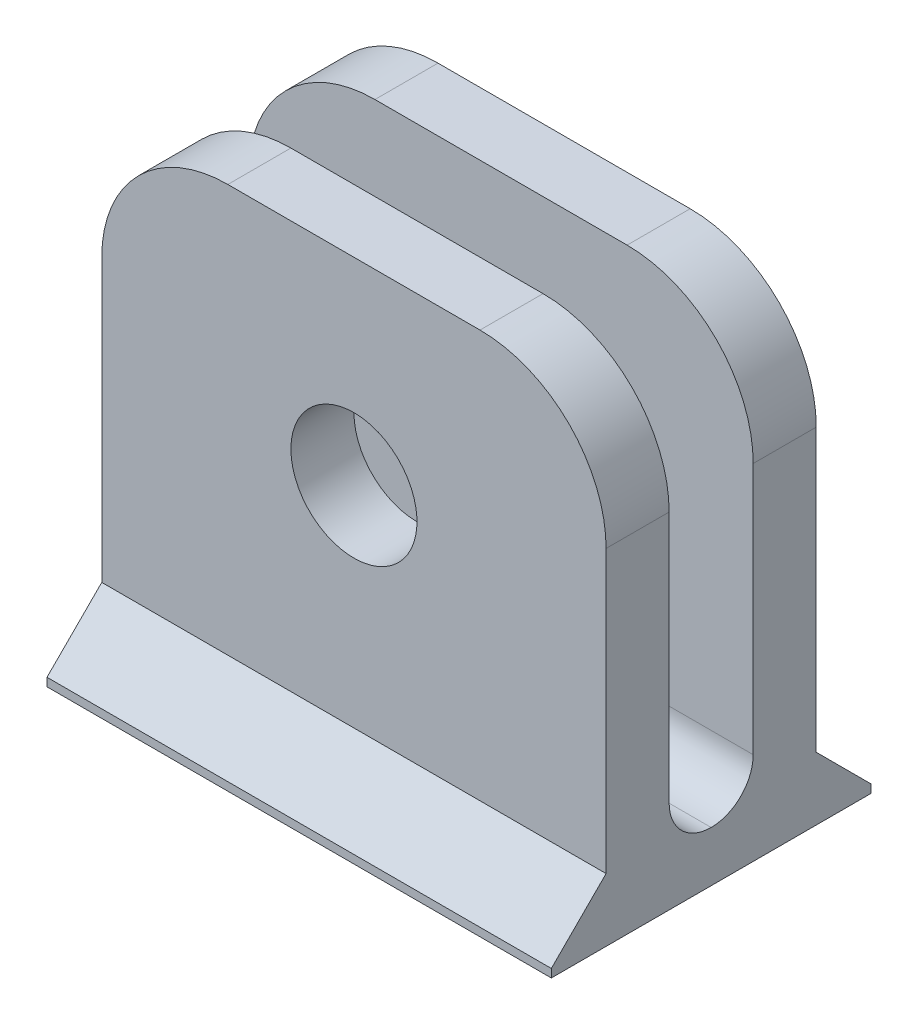
ISO-10303-21;
HEADER;
FILE_DESCRIPTION(('STEP AP214'),'2;1');
FILE_NAME('part.step','',(''),(''),'','','');
FILE_SCHEMA(('AUTOMOTIVE_DESIGN { 1 0 10303 214 1 1 1 1 }'));
ENDSEC;
DATA;
#1=APPLICATION_CONTEXT('core data for automotive mechanical design processes');
#2=APPLICATION_PROTOCOL_DEFINITION('international standard','automotive_design',2000,#1);
#3=PRODUCT_CONTEXT('',#1,'mechanical');
#4=PRODUCT('Part','Part','',(#3));
#5=PRODUCT_RELATED_PRODUCT_CATEGORY('part','',(#4));
#6=PRODUCT_DEFINITION_FORMATION('','',#4);
#7=PRODUCT_DEFINITION_CONTEXT('part definition',#1,'design');
#8=PRODUCT_DEFINITION('design','',#6,#7);
#9=PRODUCT_DEFINITION_SHAPE('','',#8);
#10=(LENGTH_UNIT() NAMED_UNIT(*) SI_UNIT(.MILLI.,.METRE.));
#11=(NAMED_UNIT(*) PLANE_ANGLE_UNIT() SI_UNIT($,.RADIAN.));
#12=(NAMED_UNIT(*) SI_UNIT($,.STERADIAN.) SOLID_ANGLE_UNIT());
#13=UNCERTAINTY_MEASURE_WITH_UNIT(LENGTH_MEASURE(1.E-05),#10,'distance_accuracy_value','');
#14=(GEOMETRIC_REPRESENTATION_CONTEXT(3) GLOBAL_UNCERTAINTY_ASSIGNED_CONTEXT((#13)) GLOBAL_UNIT_ASSIGNED_CONTEXT((#10,
#11,#12)) REPRESENTATION_CONTEXT('',''));
#15=CARTESIAN_POINT('',(0.,0.,0.));
#16=DIRECTION('',(0.,0.,1.));
#17=DIRECTION('',(1.,0.,0.));
#18=AXIS2_PLACEMENT_3D('',#15,#16,#17);
#19=CARTESIAN_POINT('',(0.,1.2,0.));
#20=DIRECTION('',(0.,0.,1.));
#21=DIRECTION('',(1.,0.,0.));
#22=AXIS2_PLACEMENT_3D('',#19,#20,#21);
#23=PLANE('',#22);
#24=CARTESIAN_POINT('',(6.,6.5,0.));
#25=DIRECTION('',(0.,0.,-1.));
#26=DIRECTION('',(-1.,0.,0.));
#27=AXIS2_PLACEMENT_3D('',#24,#25,#26);
#28=CIRCLE('',#27,1.5);
#29=CARTESIAN_POINT('',(4.5,6.5,0.));
#30=VERTEX_POINT('',#29);
#31=EDGE_CURVE('E243',#30,#30,#28,.T.);
#32=ORIENTED_EDGE('',*,*,#31,.F.);
#33=EDGE_LOOP('',(#32));
#34=FACE_BOUND('',#33,.T.);
#35=DIRECTION('',(1.,0.,0.));
#36=VECTOR('',#35,1.);
#37=CARTESIAN_POINT('',(0.,1.5,0.));
#38=LINE('',#37,#36);
#39=CARTESIAN_POINT('',(0.,1.5,0.));
#40=VERTEX_POINT('',#39);
#41=CARTESIAN_POINT('',(12.,1.5,0.));
#42=VERTEX_POINT('',#41);
#43=EDGE_CURVE('E58',#40,#42,#38,.T.);
#44=ORIENTED_EDGE('',*,*,#43,.F.);
#45=DIRECTION('',(0.,-1.,0.));
#46=VECTOR('',#45,1.);
#47=CARTESIAN_POINT('',(0.,1.2,0.));
#48=LINE('',#47,#46);
#49=CARTESIAN_POINT('',(0.,8.2,0.));
#50=VERTEX_POINT('',#49);
#51=EDGE_CURVE('E270',#50,#40,#48,.T.);
#52=ORIENTED_EDGE('',*,*,#51,.F.);
#53=CARTESIAN_POINT('',(3.,8.2,0.));
#54=DIRECTION('',(0.,0.,1.));
#55=DIRECTION('',(1.,0.,0.));
#56=AXIS2_PLACEMENT_3D('',#53,#54,#55);
#57=CIRCLE('',#56,3.);
#58=CARTESIAN_POINT('',(3.,11.2,0.));
#59=VERTEX_POINT('',#58);
#60=EDGE_CURVE('E188',#50,#59,#57,.F.);
#61=ORIENTED_EDGE('',*,*,#60,.T.);
#62=DIRECTION('',(-1.,0.,0.));
#63=VECTOR('',#62,1.);
#64=CARTESIAN_POINT('',(12.,11.2,0.));
#65=LINE('',#64,#63);
#66=CARTESIAN_POINT('',(9.,11.2,0.));
#67=VERTEX_POINT('',#66);
#68=EDGE_CURVE('E228',#67,#59,#65,.T.);
#69=ORIENTED_EDGE('',*,*,#68,.F.);
#70=CARTESIAN_POINT('',(9.,8.2,0.));
#71=DIRECTION('',(0.,0.,1.));
#72=DIRECTION('',(1.,0.,0.));
#73=AXIS2_PLACEMENT_3D('',#70,#71,#72);
#74=CIRCLE('',#73,3.);
#75=CARTESIAN_POINT('',(12.,8.2,0.));
#76=VERTEX_POINT('',#75);
#77=EDGE_CURVE('E190',#67,#76,#74,.F.);
#78=ORIENTED_EDGE('',*,*,#77,.T.);
#79=DIRECTION('',(0.,-1.,0.));
#80=VECTOR('',#79,1.);
#81=CARTESIAN_POINT('',(12.,1.2,0.));
#82=LINE('',#81,#80);
#83=EDGE_CURVE('E182',#76,#42,#82,.T.);
#84=ORIENTED_EDGE('',*,*,#83,.T.);
#85=EDGE_LOOP('',(#44,#52,#61,#69,#78,#84));
#86=FACE_BOUND('',#85,.T.);
#87=ADVANCED_FACE('F33',(#34,#86),#23,.F.);
#88=CARTESIAN_POINT('',(0.,1.2,0.));
#89=DIRECTION('',(1.,0.,0.));
#90=DIRECTION('',(0.,0.,-1.));
#91=AXIS2_PLACEMENT_3D('',#88,#89,#90);
#92=PLANE('',#91);
#93=DIRECTION('',(0.,-1.,0.));
#94=VECTOR('',#93,1.);
#95=CARTESIAN_POINT('',(0.,11.2,1.5));
#96=LINE('',#95,#94);
#97=CARTESIAN_POINT('',(0.,8.2,1.5));
#98=VERTEX_POINT('',#97);
#99=CARTESIAN_POINT('',(0.,2.2,1.5));
#100=VERTEX_POINT('',#99);
#101=EDGE_CURVE('E251',#98,#100,#96,.T.);
#102=ORIENTED_EDGE('',*,*,#101,.F.);
#103=DIRECTION('',(0.,0.,1.));
#104=VECTOR('',#103,1.);
#105=CARTESIAN_POINT('',(0.,8.2,0.));
#106=LINE('',#105,#104);
#107=EDGE_CURVE('E202',#98,#50,#106,.F.);
#108=ORIENTED_EDGE('',*,*,#107,.T.);
#109=ORIENTED_EDGE('',*,*,#51,.T.);
#110=DIRECTION('',(0.,0.707106781186546,0.707106781186549));
#111=VECTOR('',#110,1.);
#112=CARTESIAN_POINT('',(0.,1.5,0.));
#113=LINE('',#112,#111);
#114=CARTESIAN_POINT('',(0.,0.196941052617859,-1.30305894738214));
#115=VERTEX_POINT('',#114);
#116=EDGE_CURVE('E282',#115,#40,#113,.T.);
#117=ORIENTED_EDGE('',*,*,#116,.F.);
#118=DIRECTION('',(0.,1.,0.));
#119=VECTOR('',#118,1.);
#120=CARTESIAN_POINT('',(0.,0.,-1.30305894738214));
#121=LINE('',#120,#119);
#122=CARTESIAN_POINT('',(0.,0.,-1.30305894738214));
#123=VERTEX_POINT('',#122);
#124=EDGE_CURVE('E289',#123,#115,#121,.T.);
#125=ORIENTED_EDGE('',*,*,#124,.F.);
#126=DIRECTION('',(0.,0.,1.));
#127=VECTOR('',#126,1.);
#128=CARTESIAN_POINT('',(0.,0.,0.));
#129=LINE('',#128,#127);
#130=CARTESIAN_POINT('',(0.,0.,6.30305894738215));
#131=VERTEX_POINT('',#130);
#132=EDGE_CURVE('E266',#123,#131,#129,.T.);
#133=ORIENTED_EDGE('',*,*,#132,.T.);
#134=DIRECTION('',(0.,-1.,0.));
#135=VECTOR('',#134,1.);
#136=CARTESIAN_POINT('',(0.,0.,6.30305894738215));
#137=LINE('',#136,#135);
#138=CARTESIAN_POINT('',(0.,0.196941052617859,6.30305894738215));
#139=VERTEX_POINT('',#138);
#140=EDGE_CURVE('E162',#139,#131,#137,.T.);
#141=ORIENTED_EDGE('',*,*,#140,.F.);
#142=DIRECTION('',(0.,-0.707106781186546,0.707106781186549));
#143=VECTOR('',#142,1.);
#144=CARTESIAN_POINT('',(0.,1.5,5.));
#145=LINE('',#144,#143);
#146=CARTESIAN_POINT('',(0.,1.5,5.));
#147=VERTEX_POINT('',#146);
#148=EDGE_CURVE('E155',#147,#139,#145,.T.);
#149=ORIENTED_EDGE('',*,*,#148,.F.);
#150=DIRECTION('',(0.,-1.,0.));
#151=VECTOR('',#150,1.);
#152=CARTESIAN_POINT('',(0.,1.2,5.));
#153=LINE('',#152,#151);
#154=CARTESIAN_POINT('',(0.,8.2,5.));
#155=VERTEX_POINT('',#154);
#156=EDGE_CURVE('E168',#155,#147,#153,.T.);
#157=ORIENTED_EDGE('',*,*,#156,.F.);
#158=DIRECTION('',(0.,0.,1.));
#159=VECTOR('',#158,1.);
#160=CARTESIAN_POINT('',(0.,8.2,0.));
#161=LINE('',#160,#159);
#162=CARTESIAN_POINT('',(0.,8.2,3.5));
#163=VERTEX_POINT('',#162);
#164=EDGE_CURVE('E200',#155,#163,#161,.F.);
#165=ORIENTED_EDGE('',*,*,#164,.T.);
#166=DIRECTION('',(0.,-1.,0.));
#167=VECTOR('',#166,1.);
#168=CARTESIAN_POINT('',(0.,11.2,3.5));
#169=LINE('',#168,#167);
#170=CARTESIAN_POINT('',(0.,2.2,3.5));
#171=VERTEX_POINT('',#170);
#172=EDGE_CURVE('E260',#163,#171,#169,.T.);
#173=ORIENTED_EDGE('',*,*,#172,.T.);
#174=CARTESIAN_POINT('',(0.,2.2,2.5));
#175=DIRECTION('',(1.,0.,0.));
#176=DIRECTION('',(0.,0.,-1.));
#177=AXIS2_PLACEMENT_3D('',#174,#175,#176);
#178=CIRCLE('',#177,1.);
#179=CARTESIAN_POINT('',(0.,1.2,2.5));
#180=VERTEX_POINT('',#179);
#181=EDGE_CURVE('E222',#171,#180,#178,.T.);
#182=ORIENTED_EDGE('',*,*,#181,.T.);
#183=CARTESIAN_POINT('',(0.,2.2,2.5));
#184=DIRECTION('',(1.,0.,0.));
#185=DIRECTION('',(0.,0.,-1.));
#186=AXIS2_PLACEMENT_3D('',#183,#184,#185);
#187=CIRCLE('',#186,1.);
#188=EDGE_CURVE('E11',#180,#100,#187,.T.);
#189=ORIENTED_EDGE('',*,*,#188,.T.);
#190=EDGE_LOOP('',(#102,#108,#109,#117,#125,#133,#141,#149,#157,#165,#173,#182,#189));
#191=FACE_BOUND('',#190,.T.);
#192=ADVANCED_FACE('F167',(#191),#92,.F.);
#193=CARTESIAN_POINT('',(0.,1.2,5.));
#194=DIRECTION('',(0.,0.,-1.));
#195=DIRECTION('',(-1.,0.,0.));
#196=AXIS2_PLACEMENT_3D('',#193,#194,#195);
#197=PLANE('',#196);
#198=CARTESIAN_POINT('',(6.,6.5,5.));
#199=DIRECTION('',(0.,0.,-1.));
#200=DIRECTION('',(-1.,0.,0.));
#201=AXIS2_PLACEMENT_3D('',#198,#199,#200);
#202=CIRCLE('',#201,1.5);
#203=CARTESIAN_POINT('',(4.5,6.5,5.));
#204=VERTEX_POINT('',#203);
#205=EDGE_CURVE('E241',#204,#204,#202,.T.);
#206=ORIENTED_EDGE('',*,*,#205,.T.);
#207=EDGE_LOOP('',(#206));
#208=FACE_BOUND('',#207,.T.);
#209=ORIENTED_EDGE('',*,*,#156,.T.);
#210=DIRECTION('',(1.,0.,0.));
#211=VECTOR('',#210,1.);
#212=CARTESIAN_POINT('',(0.,1.5,5.));
#213=LINE('',#212,#211);
#214=CARTESIAN_POINT('',(12.,1.5,5.));
#215=VERTEX_POINT('',#214);
#216=EDGE_CURVE('E152',#147,#215,#213,.T.);
#217=ORIENTED_EDGE('',*,*,#216,.T.);
#218=DIRECTION('',(0.,-1.,0.));
#219=VECTOR('',#218,1.);
#220=CARTESIAN_POINT('',(12.,1.2,5.));
#221=LINE('',#220,#219);
#222=CARTESIAN_POINT('',(12.,8.2,5.));
#223=VERTEX_POINT('',#222);
#224=EDGE_CURVE('E177',#223,#215,#221,.T.);
#225=ORIENTED_EDGE('',*,*,#224,.F.);
#226=CARTESIAN_POINT('',(9.,8.2,5.));
#227=DIRECTION('',(0.,0.,-1.));
#228=DIRECTION('',(-1.,0.,0.));
#229=AXIS2_PLACEMENT_3D('',#226,#227,#228);
#230=CIRCLE('',#229,3.);
#231=CARTESIAN_POINT('',(9.,11.2,5.));
#232=VERTEX_POINT('',#231);
#233=EDGE_CURVE('E210',#223,#232,#230,.F.);
#234=ORIENTED_EDGE('',*,*,#233,.T.);
#235=DIRECTION('',(1.,0.,0.));
#236=VECTOR('',#235,1.);
#237=CARTESIAN_POINT('',(0.,11.2,5.));
#238=LINE('',#237,#236);
#239=CARTESIAN_POINT('',(3.,11.2,5.));
#240=VERTEX_POINT('',#239);
#241=EDGE_CURVE('E254',#240,#232,#238,.T.);
#242=ORIENTED_EDGE('',*,*,#241,.F.);
#243=CARTESIAN_POINT('',(3.,8.2,5.));
#244=DIRECTION('',(0.,0.,-1.));
#245=DIRECTION('',(-1.,0.,0.));
#246=AXIS2_PLACEMENT_3D('',#243,#244,#245);
#247=CIRCLE('',#246,3.);
#248=EDGE_CURVE('E175',#240,#155,#247,.F.);
#249=ORIENTED_EDGE('',*,*,#248,.T.);
#250=EDGE_LOOP('',(#209,#217,#225,#234,#242,#249));
#251=FACE_BOUND('',#250,.T.);
#252=ADVANCED_FACE('F173',(#208,#251),#197,.F.);
#253=CARTESIAN_POINT('',(12.,1.2,0.));
#254=DIRECTION('',(-1.,0.,0.));
#255=DIRECTION('',(0.,0.,1.));
#256=AXIS2_PLACEMENT_3D('',#253,#254,#255);
#257=PLANE('',#256);
#258=ORIENTED_EDGE('',*,*,#83,.F.);
#259=DIRECTION('',(0.,0.,-1.));
#260=VECTOR('',#259,1.);
#261=CARTESIAN_POINT('',(12.,8.2,0.));
#262=LINE('',#261,#260);
#263=CARTESIAN_POINT('',(12.,8.2,1.5));
#264=VERTEX_POINT('',#263);
#265=EDGE_CURVE('E194',#76,#264,#262,.F.);
#266=ORIENTED_EDGE('',*,*,#265,.T.);
#267=DIRECTION('',(0.,-1.,0.));
#268=VECTOR('',#267,1.);
#269=CARTESIAN_POINT('',(12.,11.2,1.5));
#270=LINE('',#269,#268);
#271=CARTESIAN_POINT('',(12.,2.2,1.5));
#272=VERTEX_POINT('',#271);
#273=EDGE_CURVE('E248',#264,#272,#270,.T.);
#274=ORIENTED_EDGE('',*,*,#273,.T.);
#275=CARTESIAN_POINT('',(12.,2.2,2.5));
#276=DIRECTION('',(-1.,0.,0.));
#277=DIRECTION('',(0.,0.,1.));
#278=AXIS2_PLACEMENT_3D('',#275,#276,#277);
#279=CIRCLE('',#278,1.);
#280=CARTESIAN_POINT('',(12.,1.2,2.5));
#281=VERTEX_POINT('',#280);
#282=EDGE_CURVE('E42',#272,#281,#279,.T.);
#283=ORIENTED_EDGE('',*,*,#282,.T.);
#284=CARTESIAN_POINT('',(12.,2.2,2.5));
#285=DIRECTION('',(-1.,0.,0.));
#286=DIRECTION('',(0.,0.,1.));
#287=AXIS2_PLACEMENT_3D('',#284,#285,#286);
#288=CIRCLE('',#287,1.);
#289=CARTESIAN_POINT('',(12.,2.2,3.5));
#290=VERTEX_POINT('',#289);
#291=EDGE_CURVE('E224',#281,#290,#288,.T.);
#292=ORIENTED_EDGE('',*,*,#291,.T.);
#293=DIRECTION('',(0.,-1.,0.));
#294=VECTOR('',#293,1.);
#295=CARTESIAN_POINT('',(12.,11.2,3.5));
#296=LINE('',#295,#294);
#297=CARTESIAN_POINT('',(12.,8.2,3.5));
#298=VERTEX_POINT('',#297);
#299=EDGE_CURVE('E263',#298,#290,#296,.T.);
#300=ORIENTED_EDGE('',*,*,#299,.F.);
#301=DIRECTION('',(0.,0.,-1.));
#302=VECTOR('',#301,1.);
#303=CARTESIAN_POINT('',(12.,8.2,0.));
#304=LINE('',#303,#302);
#305=EDGE_CURVE('E192',#298,#223,#304,.F.);
#306=ORIENTED_EDGE('',*,*,#305,.T.);
#307=ORIENTED_EDGE('',*,*,#224,.T.);
#308=DIRECTION('',(0.,-0.707106781186546,0.707106781186549));
#309=VECTOR('',#308,1.);
#310=CARTESIAN_POINT('',(12.,1.5,5.));
#311=LINE('',#310,#309);
#312=CARTESIAN_POINT('',(12.,0.196941052617859,6.30305894738215));
#313=VERTEX_POINT('',#312);
#314=EDGE_CURVE('E50',#215,#313,#311,.T.);
#315=ORIENTED_EDGE('',*,*,#314,.T.);
#316=DIRECTION('',(0.,-1.,0.));
#317=VECTOR('',#316,1.);
#318=CARTESIAN_POINT('',(12.,0.,6.30305894738215));
#319=LINE('',#318,#317);
#320=CARTESIAN_POINT('',(12.,0.,6.30305894738215));
#321=VERTEX_POINT('',#320);
#322=EDGE_CURVE('E171',#313,#321,#319,.T.);
#323=ORIENTED_EDGE('',*,*,#322,.T.);
#324=DIRECTION('',(0.,0.,-1.));
#325=VECTOR('',#324,1.);
#326=CARTESIAN_POINT('',(12.,0.,0.));
#327=LINE('',#326,#325);
#328=CARTESIAN_POINT('',(12.,0.,-1.30305894738215));
#329=VERTEX_POINT('',#328);
#330=EDGE_CURVE('E268',#321,#329,#327,.T.);
#331=ORIENTED_EDGE('',*,*,#330,.T.);
#332=DIRECTION('',(0.,1.,0.));
#333=VECTOR('',#332,1.);
#334=CARTESIAN_POINT('',(12.,0.,-1.30305894738215));
#335=LINE('',#334,#333);
#336=CARTESIAN_POINT('',(12.,0.196941052617859,-1.30305894738215));
#337=VERTEX_POINT('',#336);
#338=EDGE_CURVE('E288',#329,#337,#335,.T.);
#339=ORIENTED_EDGE('',*,*,#338,.T.);
#340=DIRECTION('',(0.,0.707106781186546,0.707106781186549));
#341=VECTOR('',#340,1.);
#342=CARTESIAN_POINT('',(12.,1.5,0.));
#343=LINE('',#342,#341);
#344=EDGE_CURVE('E280',#337,#42,#343,.T.);
#345=ORIENTED_EDGE('',*,*,#344,.T.);
#346=EDGE_LOOP('',(#258,#266,#274,#283,#292,#300,#306,#307,#315,#323,#331,#339,#345));
#347=FACE_BOUND('',#346,.T.);
#348=ADVANCED_FACE('F286',(#347),#257,.F.);
#349=CARTESIAN_POINT('',(0.,0.,0.));
#350=DIRECTION('',(0.,1.,0.));
#351=DIRECTION('',(0.,0.,1.));
#352=AXIS2_PLACEMENT_3D('',#349,#350,#351);
#353=PLANE('',#352);
#354=ORIENTED_EDGE('',*,*,#132,.F.);
#355=DIRECTION('',(1.,0.,0.));
#356=VECTOR('',#355,1.);
#357=CARTESIAN_POINT('',(0.,0.,-1.30305894738214));
#358=LINE('',#357,#356);
#359=EDGE_CURVE('E298',#123,#329,#358,.T.);
#360=ORIENTED_EDGE('',*,*,#359,.T.);
#361=ORIENTED_EDGE('',*,*,#330,.F.);
#362=DIRECTION('',(1.,0.,0.));
#363=VECTOR('',#362,1.);
#364=CARTESIAN_POINT('',(0.,0.,6.30305894738215));
#365=LINE('',#364,#363);
#366=EDGE_CURVE('E293',#131,#321,#365,.T.);
#367=ORIENTED_EDGE('',*,*,#366,.F.);
#368=EDGE_LOOP('',(#354,#360,#361,#367));
#369=FACE_BOUND('',#368,.T.);
#370=ADVANCED_FACE('F317',(#369),#353,.F.);
#371=CARTESIAN_POINT('',(0.,11.2,3.5));
#372=DIRECTION('',(0.,0.,1.));
#373=DIRECTION('',(1.,0.,0.));
#374=AXIS2_PLACEMENT_3D('',#371,#372,#373);
#375=PLANE('',#374);
#376=CARTESIAN_POINT('',(6.,6.5,3.5));
#377=DIRECTION('',(0.,0.,1.));
#378=DIRECTION('',(1.,0.,0.));
#379=AXIS2_PLACEMENT_3D('',#376,#377,#378);
#380=CIRCLE('',#379,1.5);
#381=CARTESIAN_POINT('',(7.5,6.5,3.5));
#382=VERTEX_POINT('',#381);
#383=EDGE_CURVE('E229',#382,#382,#380,.T.);
#384=ORIENTED_EDGE('',*,*,#383,.T.);
#385=EDGE_LOOP('',(#384));
#386=FACE_BOUND('',#385,.T.);
#387=ORIENTED_EDGE('',*,*,#299,.T.);
#388=DIRECTION('',(-1.,0.,0.));
#389=VECTOR('',#388,1.);
#390=CARTESIAN_POINT('',(0.,2.2,3.5));
#391=LINE('',#390,#389);
#392=EDGE_CURVE('E217',#290,#171,#391,.T.);
#393=ORIENTED_EDGE('',*,*,#392,.T.);
#394=ORIENTED_EDGE('',*,*,#172,.F.);
#395=CARTESIAN_POINT('',(3.,8.2,3.5));
#396=DIRECTION('',(0.,0.,1.));
#397=DIRECTION('',(1.,0.,0.));
#398=AXIS2_PLACEMENT_3D('',#395,#396,#397);
#399=CIRCLE('',#398,3.);
#400=CARTESIAN_POINT('',(3.,11.2,3.5));
#401=VERTEX_POINT('',#400);
#402=EDGE_CURVE('E215',#163,#401,#399,.F.);
#403=ORIENTED_EDGE('',*,*,#402,.T.);
#404=DIRECTION('',(-1.,0.,0.));
#405=VECTOR('',#404,1.);
#406=CARTESIAN_POINT('',(0.,11.2,3.5));
#407=LINE('',#406,#405);
#408=CARTESIAN_POINT('',(9.,11.2,3.5));
#409=VERTEX_POINT('',#408);
#410=EDGE_CURVE('E257',#409,#401,#407,.T.);
#411=ORIENTED_EDGE('',*,*,#410,.F.);
#412=CARTESIAN_POINT('',(9.,8.2,3.5));
#413=DIRECTION('',(0.,0.,1.));
#414=DIRECTION('',(1.,0.,0.));
#415=AXIS2_PLACEMENT_3D('',#412,#413,#414);
#416=CIRCLE('',#415,3.);
#417=EDGE_CURVE('E213',#409,#298,#416,.F.);
#418=ORIENTED_EDGE('',*,*,#417,.T.);
#419=EDGE_LOOP('',(#387,#393,#394,#403,#411,#418));
#420=FACE_BOUND('',#419,.T.);
#421=ADVANCED_FACE('F353',(#386,#420),#375,.F.);
#422=CARTESIAN_POINT('',(0.,11.2,0.));
#423=DIRECTION('',(0.,-1.,0.));
#424=DIRECTION('',(0.,0.,-1.));
#425=AXIS2_PLACEMENT_3D('',#422,#423,#424);
#426=PLANE('',#425);
#427=ORIENTED_EDGE('',*,*,#410,.T.);
#428=DIRECTION('',(0.,0.,1.));
#429=VECTOR('',#428,1.);
#430=CARTESIAN_POINT('',(3.,11.2,0.));
#431=LINE('',#430,#429);
#432=EDGE_CURVE('E207',#401,#240,#431,.T.);
#433=ORIENTED_EDGE('',*,*,#432,.T.);
#434=ORIENTED_EDGE('',*,*,#241,.T.);
#435=DIRECTION('',(0.,0.,-1.));
#436=VECTOR('',#435,1.);
#437=CARTESIAN_POINT('',(9.,11.2,0.));
#438=LINE('',#437,#436);
#439=EDGE_CURVE('E204',#232,#409,#438,.T.);
#440=ORIENTED_EDGE('',*,*,#439,.T.);
#441=EDGE_LOOP('',(#427,#433,#434,#440));
#442=FACE_BOUND('',#441,.T.);
#443=ADVANCED_FACE('F359',(#442),#426,.F.);
#444=CARTESIAN_POINT('',(12.,11.2,1.5));
#445=DIRECTION('',(0.,0.,-1.));
#446=DIRECTION('',(-1.,0.,0.));
#447=AXIS2_PLACEMENT_3D('',#444,#445,#446);
#448=PLANE('',#447);
#449=CARTESIAN_POINT('',(6.,6.5,1.5));
#450=DIRECTION('',(0.,0.,-1.));
#451=DIRECTION('',(-1.,0.,0.));
#452=AXIS2_PLACEMENT_3D('',#449,#450,#451);
#453=CIRCLE('',#452,1.5);
#454=CARTESIAN_POINT('',(4.5,6.5,1.5));
#455=VERTEX_POINT('',#454);
#456=EDGE_CURVE('E37',#455,#455,#453,.T.);
#457=ORIENTED_EDGE('',*,*,#456,.T.);
#458=EDGE_LOOP('',(#457));
#459=FACE_BOUND('',#458,.T.);
#460=ORIENTED_EDGE('',*,*,#101,.T.);
#461=DIRECTION('',(1.,0.,0.));
#462=VECTOR('',#461,1.);
#463=CARTESIAN_POINT('',(12.,2.2,1.5));
#464=LINE('',#463,#462);
#465=EDGE_CURVE('E220',#100,#272,#464,.T.);
#466=ORIENTED_EDGE('',*,*,#465,.T.);
#467=ORIENTED_EDGE('',*,*,#273,.F.);
#468=CARTESIAN_POINT('',(9.,8.2,1.5));
#469=DIRECTION('',(0.,0.,-1.));
#470=DIRECTION('',(-1.,0.,0.));
#471=AXIS2_PLACEMENT_3D('',#468,#469,#470);
#472=CIRCLE('',#471,3.);
#473=CARTESIAN_POINT('',(9.,11.2,1.5));
#474=VERTEX_POINT('',#473);
#475=EDGE_CURVE('E198',#264,#474,#472,.F.);
#476=ORIENTED_EDGE('',*,*,#475,.T.);
#477=DIRECTION('',(1.,0.,0.));
#478=VECTOR('',#477,1.);
#479=CARTESIAN_POINT('',(12.,11.2,1.5));
#480=LINE('',#479,#478);
#481=CARTESIAN_POINT('',(3.,11.2,1.5));
#482=VERTEX_POINT('',#481);
#483=EDGE_CURVE('E234',#482,#474,#480,.T.);
#484=ORIENTED_EDGE('',*,*,#483,.F.);
#485=CARTESIAN_POINT('',(3.,8.2,1.5));
#486=DIRECTION('',(0.,0.,-1.));
#487=DIRECTION('',(-1.,0.,0.));
#488=AXIS2_PLACEMENT_3D('',#485,#486,#487);
#489=CIRCLE('',#488,3.);
#490=EDGE_CURVE('E196',#482,#98,#489,.F.);
#491=ORIENTED_EDGE('',*,*,#490,.T.);
#492=EDGE_LOOP('',(#460,#466,#467,#476,#484,#491));
#493=FACE_BOUND('',#492,.T.);
#494=ADVANCED_FACE('F384',(#459,#493),#448,.F.);
#495=CARTESIAN_POINT('',(0.,11.2,0.));
#496=DIRECTION('',(0.,-1.,0.));
#497=DIRECTION('',(0.,0.,-1.));
#498=AXIS2_PLACEMENT_3D('',#495,#496,#497);
#499=PLANE('',#498);
#500=ORIENTED_EDGE('',*,*,#483,.T.);
#501=DIRECTION('',(0.,0.,-1.));
#502=VECTOR('',#501,1.);
#503=CARTESIAN_POINT('',(9.,11.2,0.));
#504=LINE('',#503,#502);
#505=EDGE_CURVE('E180',#474,#67,#504,.T.);
#506=ORIENTED_EDGE('',*,*,#505,.T.);
#507=ORIENTED_EDGE('',*,*,#68,.T.);
#508=DIRECTION('',(0.,0.,1.));
#509=VECTOR('',#508,1.);
#510=CARTESIAN_POINT('',(3.,11.2,0.));
#511=LINE('',#510,#509);
#512=EDGE_CURVE('E176',#59,#482,#511,.T.);
#513=ORIENTED_EDGE('',*,*,#512,.T.);
#514=EDGE_LOOP('',(#500,#506,#507,#513));
#515=FACE_BOUND('',#514,.T.);
#516=ADVANCED_FACE('F327',(#515),#499,.F.);
#517=CARTESIAN_POINT('',(9.,8.2,0.));
#518=DIRECTION('',(0.,0.,-1.));
#519=DIRECTION('',(-1.,0.,0.));
#520=AXIS2_PLACEMENT_3D('',#517,#518,#519);
#521=CYLINDRICAL_SURFACE('',#520,3.);
#522=ORIENTED_EDGE('',*,*,#475,.F.);
#523=ORIENTED_EDGE('',*,*,#265,.F.);
#524=ORIENTED_EDGE('',*,*,#77,.F.);
#525=ORIENTED_EDGE('',*,*,#505,.F.);
#526=EDGE_LOOP('',(#522,#523,#524,#525));
#527=FACE_BOUND('',#526,.T.);
#528=ADVANCED_FACE('F323',(#527),#521,.T.);
#529=CARTESIAN_POINT('',(3.,8.2,0.));
#530=DIRECTION('',(0.,0.,1.));
#531=DIRECTION('',(1.,0.,0.));
#532=AXIS2_PLACEMENT_3D('',#529,#530,#531);
#533=CYLINDRICAL_SURFACE('',#532,3.);
#534=ORIENTED_EDGE('',*,*,#60,.F.);
#535=ORIENTED_EDGE('',*,*,#107,.F.);
#536=ORIENTED_EDGE('',*,*,#490,.F.);
#537=ORIENTED_EDGE('',*,*,#512,.F.);
#538=EDGE_LOOP('',(#534,#535,#536,#537));
#539=FACE_BOUND('',#538,.T.);
#540=ADVANCED_FACE('F326',(#539),#533,.T.);
#541=CARTESIAN_POINT('',(3.,8.2,0.));
#542=DIRECTION('',(0.,0.,1.));
#543=DIRECTION('',(1.,0.,0.));
#544=AXIS2_PLACEMENT_3D('',#541,#542,#543);
#545=CYLINDRICAL_SURFACE('',#544,3.);
#546=ORIENTED_EDGE('',*,*,#402,.F.);
#547=ORIENTED_EDGE('',*,*,#164,.F.);
#548=ORIENTED_EDGE('',*,*,#248,.F.);
#549=ORIENTED_EDGE('',*,*,#432,.F.);
#550=EDGE_LOOP('',(#546,#547,#548,#549));
#551=FACE_BOUND('',#550,.T.);
#552=ADVANCED_FACE('F331',(#551),#545,.T.);
#553=CARTESIAN_POINT('',(9.,8.2,0.));
#554=DIRECTION('',(0.,0.,-1.));
#555=DIRECTION('',(-1.,0.,0.));
#556=AXIS2_PLACEMENT_3D('',#553,#554,#555);
#557=CYLINDRICAL_SURFACE('',#556,3.);
#558=ORIENTED_EDGE('',*,*,#233,.F.);
#559=ORIENTED_EDGE('',*,*,#305,.F.);
#560=ORIENTED_EDGE('',*,*,#417,.F.);
#561=ORIENTED_EDGE('',*,*,#439,.F.);
#562=EDGE_LOOP('',(#558,#559,#560,#561));
#563=FACE_BOUND('',#562,.T.);
#564=ADVANCED_FACE('F335',(#563),#557,.T.);
#565=CARTESIAN_POINT('',(12.,2.2,2.5));
#566=DIRECTION('',(1.,0.,0.));
#567=DIRECTION('',(0.,0.,-1.));
#568=AXIS2_PLACEMENT_3D('',#565,#566,#567);
#569=CYLINDRICAL_SURFACE('',#568,1.);
#570=DIRECTION('',(1.,0.,0.));
#571=VECTOR('',#570,1.);
#572=CARTESIAN_POINT('',(0.,1.2,2.5));
#573=LINE('',#572,#571);
#574=EDGE_CURVE('E226',#281,#180,#573,.F.);
#575=ORIENTED_EDGE('',*,*,#574,.F.);
#576=ORIENTED_EDGE('',*,*,#282,.F.);
#577=ORIENTED_EDGE('',*,*,#465,.F.);
#578=ORIENTED_EDGE('',*,*,#188,.F.);
#579=EDGE_LOOP('',(#575,#576,#577,#578));
#580=FACE_BOUND('',#579,.T.);
#581=ADVANCED_FACE('F35',(#580),#569,.F.);
#582=CARTESIAN_POINT('',(0.,2.2,2.5));
#583=DIRECTION('',(-1.,0.,0.));
#584=DIRECTION('',(0.,0.,1.));
#585=AXIS2_PLACEMENT_3D('',#582,#583,#584);
#586=CYLINDRICAL_SURFACE('',#585,1.);
#587=ORIENTED_EDGE('',*,*,#291,.F.);
#588=ORIENTED_EDGE('',*,*,#574,.T.);
#589=ORIENTED_EDGE('',*,*,#181,.F.);
#590=ORIENTED_EDGE('',*,*,#392,.F.);
#591=EDGE_LOOP('',(#587,#588,#589,#590));
#592=FACE_BOUND('',#591,.T.);
#593=ADVANCED_FACE('F339',(#592),#586,.F.);
#594=CARTESIAN_POINT('',(6.,6.5,5.));
#595=DIRECTION('',(0.,0.,-1.));
#596=DIRECTION('',(-1.,0.,0.));
#597=AXIS2_PLACEMENT_3D('',#594,#595,#596);
#598=CYLINDRICAL_SURFACE('',#597,1.5);
#599=ORIENTED_EDGE('',*,*,#31,.T.);
#600=EDGE_LOOP('',(#599));
#601=FACE_BOUND('',#600,.T.);
#602=ORIENTED_EDGE('',*,*,#456,.F.);
#603=EDGE_LOOP('',(#602));
#604=FACE_BOUND('',#603,.T.);
#605=ADVANCED_FACE('F306',(#601,#604),#598,.F.);
#606=ORIENTED_EDGE('',*,*,#205,.F.);
#607=EDGE_LOOP('',(#606));
#608=FACE_BOUND('',#607,.T.);
#609=ORIENTED_EDGE('',*,*,#383,.F.);
#610=EDGE_LOOP('',(#609));
#611=FACE_BOUND('',#610,.T.);
#612=ADVANCED_FACE('F345',(#608,#611),#598,.F.);
#613=CARTESIAN_POINT('',(0.,1.5,0.));
#614=DIRECTION('',(0.,0.707106781186548,-0.707106781186546));
#615=DIRECTION('',(0.,0.707106781186546,0.707106781186549));
#616=AXIS2_PLACEMENT_3D('',#613,#614,#615);
#617=PLANE('',#616);
#618=ORIENTED_EDGE('',*,*,#344,.F.);
#619=DIRECTION('',(1.,0.,0.));
#620=VECTOR('',#619,1.);
#621=CARTESIAN_POINT('',(0.,0.196941052617859,-1.30305894738214));
#622=LINE('',#621,#620);
#623=EDGE_CURVE('E283',#115,#337,#622,.T.);
#624=ORIENTED_EDGE('',*,*,#623,.F.);
#625=ORIENTED_EDGE('',*,*,#116,.T.);
#626=ORIENTED_EDGE('',*,*,#43,.T.);
#627=EDGE_LOOP('',(#618,#624,#625,#626));
#628=FACE_BOUND('',#627,.T.);
#629=ADVANCED_FACE('F279',(#628),#617,.T.);
#630=CARTESIAN_POINT('',(0.,0.,-1.30305894738214));
#631=DIRECTION('',(0.,0.,-1.));
#632=DIRECTION('',(0.,1.,0.));
#633=AXIS2_PLACEMENT_3D('',#630,#631,#632);
#634=PLANE('',#633);
#635=ORIENTED_EDGE('',*,*,#338,.F.);
#636=ORIENTED_EDGE('',*,*,#359,.F.);
#637=ORIENTED_EDGE('',*,*,#124,.T.);
#638=ORIENTED_EDGE('',*,*,#623,.T.);
#639=EDGE_LOOP('',(#635,#636,#637,#638));
#640=FACE_BOUND('',#639,.T.);
#641=ADVANCED_FACE('F376',(#640),#634,.T.);
#642=CARTESIAN_POINT('',(0.,0.,6.30305894738215));
#643=DIRECTION('',(0.,0.,1.));
#644=DIRECTION('',(0.,-1.,0.));
#645=AXIS2_PLACEMENT_3D('',#642,#643,#644);
#646=PLANE('',#645);
#647=ORIENTED_EDGE('',*,*,#322,.F.);
#648=DIRECTION('',(1.,0.,0.));
#649=VECTOR('',#648,1.);
#650=CARTESIAN_POINT('',(0.,0.196941052617859,6.30305894738215));
#651=LINE('',#650,#649);
#652=EDGE_CURVE('E161',#139,#313,#651,.T.);
#653=ORIENTED_EDGE('',*,*,#652,.F.);
#654=ORIENTED_EDGE('',*,*,#140,.T.);
#655=ORIENTED_EDGE('',*,*,#366,.T.);
#656=EDGE_LOOP('',(#647,#653,#654,#655));
#657=FACE_BOUND('',#656,.T.);
#658=ADVANCED_FACE('F366',(#657),#646,.T.);
#659=CARTESIAN_POINT('',(0.,1.5,5.));
#660=DIRECTION('',(0.,0.707106781186549,0.707106781186546));
#661=DIRECTION('',(0.,-0.707106781186546,0.707106781186549));
#662=AXIS2_PLACEMENT_3D('',#659,#660,#661);
#663=PLANE('',#662);
#664=ORIENTED_EDGE('',*,*,#314,.F.);
#665=ORIENTED_EDGE('',*,*,#216,.F.);
#666=ORIENTED_EDGE('',*,*,#148,.T.);
#667=ORIENTED_EDGE('',*,*,#652,.T.);
#668=EDGE_LOOP('',(#664,#665,#666,#667));
#669=FACE_BOUND('',#668,.T.);
#670=ADVANCED_FACE('F154',(#669),#663,.T.);
#671=CLOSED_SHELL('',(#87,#192,#252,#348,#370,#421,#443,#494,#516,#528,#540,#552,#564,#581,#593,
#605,#612,#629,#641,#658,#670));
#672=MANIFOLD_SOLID_BREP('B2',#671);
#673=ADVANCED_BREP_SHAPE_REPRESENTATION('',(#18,#672),#14);
#674=SHAPE_DEFINITION_REPRESENTATION(#9,#673);
ENDSEC;
END-ISO-10303-21;
